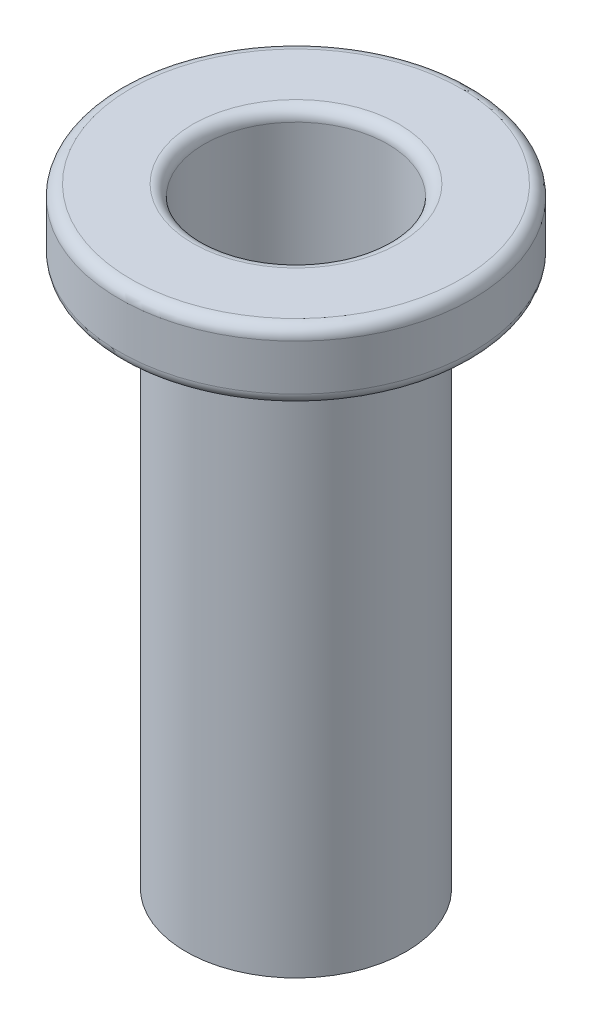
ISO-10303-21;
HEADER;
FILE_DESCRIPTION(('STEP AP214'),'2;1');
FILE_NAME('part.step','',(''),(''),'','','');
FILE_SCHEMA(('AUTOMOTIVE_DESIGN { 1 0 10303 214 1 1 1 1 }'));
ENDSEC;
DATA;
#1=APPLICATION_CONTEXT('core data for automotive mechanical design processes');
#2=APPLICATION_PROTOCOL_DEFINITION('international standard','automotive_design',2000,#1);
#3=PRODUCT_CONTEXT('',#1,'mechanical');
#4=PRODUCT('Part','Part','',(#3));
#5=PRODUCT_RELATED_PRODUCT_CATEGORY('part','',(#4));
#6=PRODUCT_DEFINITION_FORMATION('','',#4);
#7=PRODUCT_DEFINITION_CONTEXT('part definition',#1,'design');
#8=PRODUCT_DEFINITION('design','',#6,#7);
#9=PRODUCT_DEFINITION_SHAPE('','',#8);
#10=(LENGTH_UNIT() NAMED_UNIT(*) SI_UNIT(.MILLI.,.METRE.));
#11=(NAMED_UNIT(*) PLANE_ANGLE_UNIT() SI_UNIT($,.RADIAN.));
#12=(NAMED_UNIT(*) SI_UNIT($,.STERADIAN.) SOLID_ANGLE_UNIT());
#13=UNCERTAINTY_MEASURE_WITH_UNIT(LENGTH_MEASURE(1.E-05),#10,'distance_accuracy_value','');
#14=(GEOMETRIC_REPRESENTATION_CONTEXT(3) GLOBAL_UNCERTAINTY_ASSIGNED_CONTEXT((#13)) GLOBAL_UNIT_ASSIGNED_CONTEXT((#10,
#11,#12)) REPRESENTATION_CONTEXT('',''));
#15=CARTESIAN_POINT('',(0.,0.,0.));
#16=DIRECTION('',(0.,0.,1.));
#17=DIRECTION('',(1.,0.,0.));
#18=AXIS2_PLACEMENT_3D('',#15,#16,#17);
#19=CARTESIAN_POINT('',(-3.85,0.,0.));
#20=DIRECTION('',(0.,1.,0.));
#21=DIRECTION('',(-1.,0.,0.));
#22=AXIS2_PLACEMENT_3D('',#19,#20,#21);
#23=PLANE('',#22);
#24=CARTESIAN_POINT('',(0.,0.,0.));
#25=DIRECTION('',(0.,1.,0.));
#26=DIRECTION('',(-1.,0.,0.));
#27=AXIS2_PLACEMENT_3D('',#24,#25,#26);
#28=CIRCLE('',#27,3.6);
#29=CARTESIAN_POINT('',(-3.6,0.,0.));
#30=VERTEX_POINT('',#29);
#31=EDGE_CURVE('E34',#30,#30,#28,.T.);
#32=ORIENTED_EDGE('',*,*,#31,.T.);
#33=EDGE_LOOP('',(#32));
#34=FACE_BOUND('',#33,.T.);
#35=CARTESIAN_POINT('',(0.,0.,0.));
#36=DIRECTION('',(0.,1.,0.));
#37=DIRECTION('',(-1.,0.,0.));
#38=AXIS2_PLACEMENT_3D('',#35,#36,#37);
#39=CIRCLE('',#38,2.25);
#40=CARTESIAN_POINT('',(-2.25,0.,0.));
#41=VERTEX_POINT('',#40);
#42=EDGE_CURVE('E37',#41,#41,#39,.F.);
#43=ORIENTED_EDGE('',*,*,#42,.T.);
#44=EDGE_LOOP('',(#43));
#45=FACE_BOUND('',#44,.T.);
#46=ADVANCED_FACE('F14',(#34,#45),#23,.T.);
#47=CARTESIAN_POINT('',(0.,-13.3,0.));
#48=DIRECTION('',(0.,-1.,0.));
#49=DIRECTION('',(1.,0.,0.));
#50=AXIS2_PLACEMENT_3D('',#47,#48,#49);
#51=PLANE('',#50);
#52=CARTESIAN_POINT('',(0.,-13.3,0.));
#53=DIRECTION('',(0.,1.,0.));
#54=DIRECTION('',(-1.,0.,0.));
#55=AXIS2_PLACEMENT_3D('',#52,#53,#54);
#56=CIRCLE('',#55,2.);
#57=CARTESIAN_POINT('',(-2.,-13.3,0.));
#58=VERTEX_POINT('',#57);
#59=EDGE_CURVE('E46',#58,#58,#56,.T.);
#60=ORIENTED_EDGE('',*,*,#59,.T.);
#61=EDGE_LOOP('',(#60));
#62=FACE_BOUND('',#61,.T.);
#63=CARTESIAN_POINT('',(0.,-13.3,0.));
#64=DIRECTION('',(0.,1.,0.));
#65=DIRECTION('',(-1.,0.,0.));
#66=AXIS2_PLACEMENT_3D('',#63,#64,#65);
#67=CIRCLE('',#66,2.4);
#68=CARTESIAN_POINT('',(-2.4,-13.3,0.));
#69=VERTEX_POINT('',#68);
#70=EDGE_CURVE('E40',#69,#69,#67,.T.);
#71=ORIENTED_EDGE('',*,*,#70,.F.);
#72=EDGE_LOOP('',(#71));
#73=FACE_BOUND('',#72,.T.);
#74=ADVANCED_FACE('F50',(#62,#73),#51,.T.);
#75=CARTESIAN_POINT('',(0.,0.,0.));
#76=DIRECTION('',(0.,1.,0.));
#77=DIRECTION('',(-1.,0.,0.));
#78=AXIS2_PLACEMENT_3D('',#75,#76,#77);
#79=CYLINDRICAL_SURFACE('',#78,2.4);
#80=ORIENTED_EDGE('',*,*,#70,.T.);
#81=EDGE_LOOP('',(#80));
#82=FACE_BOUND('',#81,.T.);
#83=CARTESIAN_POINT('',(0.,-1.5,0.));
#84=DIRECTION('',(0.,1.,0.));
#85=DIRECTION('',(-1.,0.,0.));
#86=AXIS2_PLACEMENT_3D('',#83,#84,#85);
#87=CIRCLE('',#86,2.4);
#88=CARTESIAN_POINT('',(-2.4,-1.5,0.));
#89=VERTEX_POINT('',#88);
#90=EDGE_CURVE('E43',#89,#89,#87,.T.);
#91=ORIENTED_EDGE('',*,*,#90,.F.);
#92=EDGE_LOOP('',(#91));
#93=FACE_BOUND('',#92,.T.);
#94=ADVANCED_FACE('F77',(#82,#93),#79,.T.);
#95=CARTESIAN_POINT('',(-2.4,-1.5,0.));
#96=DIRECTION('',(0.,-1.,0.));
#97=DIRECTION('',(1.,0.,0.));
#98=AXIS2_PLACEMENT_3D('',#95,#96,#97);
#99=PLANE('',#98);
#100=CARTESIAN_POINT('',(0.,-1.5,0.));
#101=DIRECTION('',(0.,-1.,0.));
#102=DIRECTION('',(1.,0.,0.));
#103=AXIS2_PLACEMENT_3D('',#100,#101,#102);
#104=CIRCLE('',#103,3.6);
#105=CARTESIAN_POINT('',(3.6,-1.5,0.));
#106=VERTEX_POINT('',#105);
#107=EDGE_CURVE('E21',#106,#106,#104,.T.);
#108=ORIENTED_EDGE('',*,*,#107,.T.);
#109=EDGE_LOOP('',(#108));
#110=FACE_BOUND('',#109,.T.);
#111=ORIENTED_EDGE('',*,*,#90,.T.);
#112=EDGE_LOOP('',(#111));
#113=FACE_BOUND('',#112,.T.);
#114=ADVANCED_FACE('F67',(#110,#113),#99,.T.);
#115=CARTESIAN_POINT('',(0.,0.,0.));
#116=DIRECTION('',(0.,1.,0.));
#117=DIRECTION('',(-1.,0.,0.));
#118=AXIS2_PLACEMENT_3D('',#115,#116,#117);
#119=CYLINDRICAL_SURFACE('',#118,3.85);
#120=CARTESIAN_POINT('',(0.,-0.25,0.));
#121=DIRECTION('',(0.,1.,0.));
#122=DIRECTION('',(-1.,0.,0.));
#123=AXIS2_PLACEMENT_3D('',#120,#121,#122);
#124=CIRCLE('',#123,3.85);
#125=CARTESIAN_POINT('',(-3.85,-0.25,0.));
#126=VERTEX_POINT('',#125);
#127=EDGE_CURVE('E25',#126,#126,#124,.F.);
#128=ORIENTED_EDGE('',*,*,#127,.T.);
#129=EDGE_LOOP('',(#128));
#130=FACE_BOUND('',#129,.T.);
#131=CARTESIAN_POINT('',(0.,-1.25,0.));
#132=DIRECTION('',(0.,-1.,0.));
#133=DIRECTION('',(1.,0.,0.));
#134=AXIS2_PLACEMENT_3D('',#131,#132,#133);
#135=CIRCLE('',#134,3.85);
#136=CARTESIAN_POINT('',(3.85,-1.25,0.));
#137=VERTEX_POINT('',#136);
#138=EDGE_CURVE('E29',#137,#137,#135,.F.);
#139=ORIENTED_EDGE('',*,*,#138,.T.);
#140=EDGE_LOOP('',(#139));
#141=FACE_BOUND('',#140,.T.);
#142=ADVANCED_FACE('F56',(#130,#141),#119,.T.);
#143=CARTESIAN_POINT('',(0.,-13.3,0.));
#144=DIRECTION('',(0.,1.,0.));
#145=DIRECTION('',(-1.,0.,0.));
#146=AXIS2_PLACEMENT_3D('',#143,#144,#145);
#147=CYLINDRICAL_SURFACE('',#146,2.);
#148=CARTESIAN_POINT('',(0.,-0.25,0.));
#149=DIRECTION('',(0.,1.,0.));
#150=DIRECTION('',(-1.,0.,0.));
#151=AXIS2_PLACEMENT_3D('',#148,#149,#150);
#152=CIRCLE('',#151,2.);
#153=CARTESIAN_POINT('',(-2.,-0.25,0.));
#154=VERTEX_POINT('',#153);
#155=EDGE_CURVE('E9',#154,#154,#152,.T.);
#156=ORIENTED_EDGE('',*,*,#155,.T.);
#157=EDGE_LOOP('',(#156));
#158=FACE_BOUND('',#157,.T.);
#159=ORIENTED_EDGE('',*,*,#59,.F.);
#160=EDGE_LOOP('',(#159));
#161=FACE_BOUND('',#160,.T.);
#162=ADVANCED_FACE('F53',(#158,#161),#147,.F.);
#163=CARTESIAN_POINT('',(0.,-0.25,0.));
#164=DIRECTION('',(0.,1.,0.));
#165=DIRECTION('',(-1.,0.,0.));
#166=AXIS2_PLACEMENT_3D('',#163,#164,#165);
#167=TOROIDAL_SURFACE('',#166,3.6,0.25);
#168=ORIENTED_EDGE('',*,*,#127,.F.);
#169=EDGE_LOOP('',(#168));
#170=FACE_BOUND('',#169,.T.);
#171=ORIENTED_EDGE('',*,*,#31,.F.);
#172=EDGE_LOOP('',(#171));
#173=FACE_BOUND('',#172,.T.);
#174=ADVANCED_FACE('F55',(#170,#173),#167,.T.);
#175=CARTESIAN_POINT('',(0.,-1.25,0.));
#176=DIRECTION('',(0.,-1.,0.));
#177=DIRECTION('',(1.,0.,0.));
#178=AXIS2_PLACEMENT_3D('',#175,#176,#177);
#179=TOROIDAL_SURFACE('',#178,3.6,0.25);
#180=ORIENTED_EDGE('',*,*,#107,.F.);
#181=EDGE_LOOP('',(#180));
#182=FACE_BOUND('',#181,.T.);
#183=ORIENTED_EDGE('',*,*,#138,.F.);
#184=EDGE_LOOP('',(#183));
#185=FACE_BOUND('',#184,.T.);
#186=ADVANCED_FACE('F64',(#182,#185),#179,.T.);
#187=CARTESIAN_POINT('',(0.,-0.25,0.));
#188=DIRECTION('',(0.,1.,0.));
#189=DIRECTION('',(-1.,0.,0.));
#190=AXIS2_PLACEMENT_3D('',#187,#188,#189);
#191=TOROIDAL_SURFACE('',#190,2.25,0.25);
#192=ORIENTED_EDGE('',*,*,#42,.F.);
#193=EDGE_LOOP('',(#192));
#194=FACE_BOUND('',#193,.T.);
#195=ORIENTED_EDGE('',*,*,#155,.F.);
#196=EDGE_LOOP('',(#195));
#197=FACE_BOUND('',#196,.T.);
#198=ADVANCED_FACE('F16',(#194,#197),#191,.T.);
#199=CLOSED_SHELL('',(#46,#74,#94,#114,#142,#162,#174,#186,#198));
#200=MANIFOLD_SOLID_BREP('B1',#199);
#201=ADVANCED_BREP_SHAPE_REPRESENTATION('',(#18,#200),#14);
#202=SHAPE_DEFINITION_REPRESENTATION(#9,#201);
ENDSEC;
END-ISO-10303-21;
